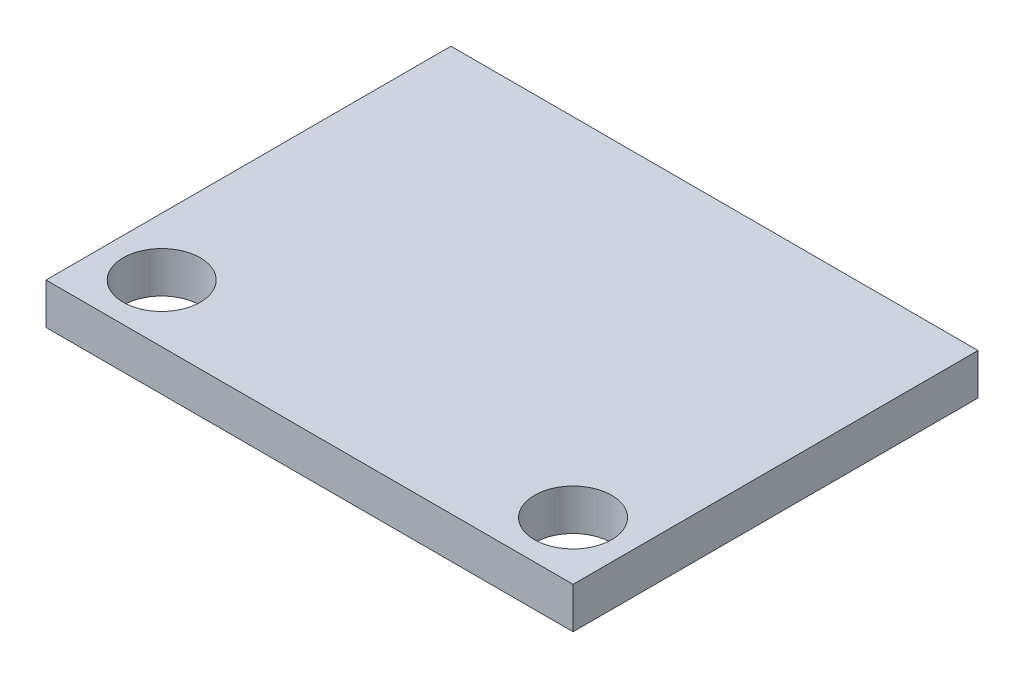
ISO-10303-21;
HEADER;
FILE_DESCRIPTION(('STEP AP214'),'2;1');
FILE_NAME('part.step','',(''),(''),'','','');
FILE_SCHEMA(('AUTOMOTIVE_DESIGN { 1 0 10303 214 1 1 1 1 }'));
ENDSEC;
DATA;
#1=APPLICATION_CONTEXT('core data for automotive mechanical design processes');
#2=APPLICATION_PROTOCOL_DEFINITION('international standard','automotive_design',2000,#1);
#3=PRODUCT_CONTEXT('',#1,'mechanical');
#4=PRODUCT('Part','Part','',(#3));
#5=PRODUCT_RELATED_PRODUCT_CATEGORY('part','',(#4));
#6=PRODUCT_DEFINITION_FORMATION('','',#4);
#7=PRODUCT_DEFINITION_CONTEXT('part definition',#1,'design');
#8=PRODUCT_DEFINITION('design','',#6,#7);
#9=PRODUCT_DEFINITION_SHAPE('','',#8);
#10=(LENGTH_UNIT() NAMED_UNIT(*) SI_UNIT(.MILLI.,.METRE.));
#11=(NAMED_UNIT(*) PLANE_ANGLE_UNIT() SI_UNIT($,.RADIAN.));
#12=(NAMED_UNIT(*) SI_UNIT($,.STERADIAN.) SOLID_ANGLE_UNIT());
#13=UNCERTAINTY_MEASURE_WITH_UNIT(LENGTH_MEASURE(1.E-05),#10,'distance_accuracy_value','');
#14=(GEOMETRIC_REPRESENTATION_CONTEXT(3) GLOBAL_UNCERTAINTY_ASSIGNED_CONTEXT((#13)) GLOBAL_UNIT_ASSIGNED_CONTEXT((#10,
#11,#12)) REPRESENTATION_CONTEXT('',''));
#15=CARTESIAN_POINT('',(0.,0.,0.));
#16=DIRECTION('',(0.,0.,1.));
#17=DIRECTION('',(1.,0.,0.));
#18=AXIS2_PLACEMENT_3D('',#15,#16,#17);
#19=CARTESIAN_POINT('',(0.,1.6,0.));
#20=DIRECTION('',(0.,-1.,0.));
#21=DIRECTION('',(0.,0.,-1.));
#22=AXIS2_PLACEMENT_3D('',#19,#20,#21);
#23=PLANE('',#22);
#24=DIRECTION('',(0.,0.,-1.));
#25=VECTOR('',#24,1.);
#26=CARTESIAN_POINT('',(10.25,1.6,7.875));
#27=LINE('',#26,#25);
#28=CARTESIAN_POINT('',(10.25,1.6,7.875));
#29=VERTEX_POINT('',#28);
#30=CARTESIAN_POINT('',(10.25,1.6,-7.875));
#31=VERTEX_POINT('',#30);
#32=EDGE_CURVE('E93',#29,#31,#27,.T.);
#33=ORIENTED_EDGE('',*,*,#32,.T.);
#34=DIRECTION('',(-1.,0.,0.));
#35=VECTOR('',#34,1.);
#36=CARTESIAN_POINT('',(-10.25,1.6,-7.875));
#37=LINE('',#36,#35);
#38=CARTESIAN_POINT('',(-10.25,1.6,-7.875));
#39=VERTEX_POINT('',#38);
#40=EDGE_CURVE('E88',#31,#39,#37,.T.);
#41=ORIENTED_EDGE('',*,*,#40,.T.);
#42=DIRECTION('',(0.,0.,1.));
#43=VECTOR('',#42,1.);
#44=CARTESIAN_POINT('',(-10.25,1.6,7.875));
#45=LINE('',#44,#43);
#46=CARTESIAN_POINT('',(-10.25,1.6,7.875));
#47=VERTEX_POINT('',#46);
#48=EDGE_CURVE('E91',#39,#47,#45,.T.);
#49=ORIENTED_EDGE('',*,*,#48,.T.);
#50=DIRECTION('',(1.,0.,0.));
#51=VECTOR('',#50,1.);
#52=CARTESIAN_POINT('',(-10.25,1.6,7.875));
#53=LINE('',#52,#51);
#54=EDGE_CURVE('E58',#47,#29,#53,.T.);
#55=ORIENTED_EDGE('',*,*,#54,.T.);
#56=EDGE_LOOP('',(#33,#41,#49,#55));
#57=FACE_BOUND('',#56,.T.);
#58=CARTESIAN_POINT('',(8.,1.6,5.625));
#59=DIRECTION('',(0.,1.,0.));
#60=DIRECTION('',(0.,0.,1.));
#61=AXIS2_PLACEMENT_3D('',#58,#59,#60);
#62=CIRCLE('',#61,1.5);
#63=CARTESIAN_POINT('',(8.,1.6,7.125));
#64=VERTEX_POINT('',#63);
#65=EDGE_CURVE('E108',#64,#64,#62,.T.);
#66=ORIENTED_EDGE('',*,*,#65,.F.);
#67=EDGE_LOOP('',(#66));
#68=FACE_BOUND('',#67,.T.);
#69=CARTESIAN_POINT('',(-8.00000000000001,1.6,5.625));
#70=DIRECTION('',(0.,1.,0.));
#71=DIRECTION('',(0.,0.,-1.));
#72=AXIS2_PLACEMENT_3D('',#69,#70,#71);
#73=CIRCLE('',#72,1.5);
#74=CARTESIAN_POINT('',(-8.00000000000001,1.6,4.125));
#75=VERTEX_POINT('',#74);
#76=EDGE_CURVE('E123',#75,#75,#73,.T.);
#77=ORIENTED_EDGE('',*,*,#76,.F.);
#78=EDGE_LOOP('',(#77));
#79=FACE_BOUND('',#78,.T.);
#80=ADVANCED_FACE('F41',(#57,#68,#79),#23,.F.);
#81=CARTESIAN_POINT('',(0.,0.,0.));
#82=DIRECTION('',(0.,-1.,0.));
#83=DIRECTION('',(0.,0.,-1.));
#84=AXIS2_PLACEMENT_3D('',#81,#82,#83);
#85=PLANE('',#84);
#86=CARTESIAN_POINT('',(8.,0.,5.625));
#87=DIRECTION('',(0.,1.,0.));
#88=DIRECTION('',(0.,0.,1.));
#89=AXIS2_PLACEMENT_3D('',#86,#87,#88);
#90=CIRCLE('',#89,1.5);
#91=CARTESIAN_POINT('',(8.,0.,7.125));
#92=VERTEX_POINT('',#91);
#93=EDGE_CURVE('E120',#92,#92,#90,.T.);
#94=ORIENTED_EDGE('',*,*,#93,.T.);
#95=EDGE_LOOP('',(#94));
#96=FACE_BOUND('',#95,.T.);
#97=DIRECTION('',(0.,0.,-1.));
#98=VECTOR('',#97,1.);
#99=CARTESIAN_POINT('',(10.25,0.,7.875));
#100=LINE('',#99,#98);
#101=CARTESIAN_POINT('',(10.25,0.,7.875));
#102=VERTEX_POINT('',#101);
#103=CARTESIAN_POINT('',(10.25,0.,-7.875));
#104=VERTEX_POINT('',#103);
#105=EDGE_CURVE('E105',#102,#104,#100,.T.);
#106=ORIENTED_EDGE('',*,*,#105,.F.);
#107=DIRECTION('',(1.,0.,0.));
#108=VECTOR('',#107,1.);
#109=CARTESIAN_POINT('',(-10.25,0.,7.875));
#110=LINE('',#109,#108);
#111=CARTESIAN_POINT('',(-10.25,0.,7.875));
#112=VERTEX_POINT('',#111);
#113=EDGE_CURVE('E81',#112,#102,#110,.T.);
#114=ORIENTED_EDGE('',*,*,#113,.F.);
#115=DIRECTION('',(0.,0.,1.));
#116=VECTOR('',#115,1.);
#117=CARTESIAN_POINT('',(-10.25,0.,7.875));
#118=LINE('',#117,#116);
#119=CARTESIAN_POINT('',(-10.25,0.,-7.875));
#120=VERTEX_POINT('',#119);
#121=EDGE_CURVE('E75',#120,#112,#118,.T.);
#122=ORIENTED_EDGE('',*,*,#121,.F.);
#123=DIRECTION('',(-1.,0.,0.));
#124=VECTOR('',#123,1.);
#125=CARTESIAN_POINT('',(-10.25,0.,-7.875));
#126=LINE('',#125,#124);
#127=EDGE_CURVE('E97',#104,#120,#126,.T.);
#128=ORIENTED_EDGE('',*,*,#127,.F.);
#129=EDGE_LOOP('',(#106,#114,#122,#128));
#130=FACE_BOUND('',#129,.T.);
#131=CARTESIAN_POINT('',(-8.00000000000001,0.,5.625));
#132=DIRECTION('',(0.,1.,0.));
#133=DIRECTION('',(0.,0.,-1.));
#134=AXIS2_PLACEMENT_3D('',#131,#132,#133);
#135=CIRCLE('',#134,1.5);
#136=CARTESIAN_POINT('',(-8.00000000000001,0.,4.125));
#137=VERTEX_POINT('',#136);
#138=EDGE_CURVE('E126',#137,#137,#135,.T.);
#139=ORIENTED_EDGE('',*,*,#138,.T.);
#140=EDGE_LOOP('',(#139));
#141=FACE_BOUND('',#140,.T.);
#142=ADVANCED_FACE('F116',(#96,#130,#141),#85,.T.);
#143=CARTESIAN_POINT('',(10.25,1.6,7.875));
#144=DIRECTION('',(-1.,0.,0.));
#145=DIRECTION('',(0.,0.,1.));
#146=AXIS2_PLACEMENT_3D('',#143,#144,#145);
#147=PLANE('',#146);
#148=ORIENTED_EDGE('',*,*,#105,.T.);
#149=DIRECTION('',(0.,-1.,0.));
#150=VECTOR('',#149,1.);
#151=CARTESIAN_POINT('',(10.25,1.6,-7.875));
#152=LINE('',#151,#150);
#153=EDGE_CURVE('E11',#31,#104,#152,.T.);
#154=ORIENTED_EDGE('',*,*,#153,.F.);
#155=ORIENTED_EDGE('',*,*,#32,.F.);
#156=DIRECTION('',(0.,-1.,0.));
#157=VECTOR('',#156,1.);
#158=CARTESIAN_POINT('',(10.25,1.6,7.875));
#159=LINE('',#158,#157);
#160=EDGE_CURVE('E101',#29,#102,#159,.T.);
#161=ORIENTED_EDGE('',*,*,#160,.T.);
#162=EDGE_LOOP('',(#148,#154,#155,#161));
#163=FACE_BOUND('',#162,.T.);
#164=ADVANCED_FACE('F43',(#163),#147,.F.);
#165=CARTESIAN_POINT('',(-10.25,1.6,-7.875));
#166=DIRECTION('',(0.,0.,1.));
#167=DIRECTION('',(1.,0.,0.));
#168=AXIS2_PLACEMENT_3D('',#165,#166,#167);
#169=PLANE('',#168);
#170=ORIENTED_EDGE('',*,*,#127,.T.);
#171=DIRECTION('',(0.,-1.,0.));
#172=VECTOR('',#171,1.);
#173=CARTESIAN_POINT('',(-10.25,1.6,-7.875));
#174=LINE('',#173,#172);
#175=EDGE_CURVE('E50',#39,#120,#174,.T.);
#176=ORIENTED_EDGE('',*,*,#175,.F.);
#177=ORIENTED_EDGE('',*,*,#40,.F.);
#178=ORIENTED_EDGE('',*,*,#153,.T.);
#179=EDGE_LOOP('',(#170,#176,#177,#178));
#180=FACE_BOUND('',#179,.T.);
#181=ADVANCED_FACE('F96',(#180),#169,.F.);
#182=CARTESIAN_POINT('',(-10.25,1.6,7.875));
#183=DIRECTION('',(1.,0.,0.));
#184=DIRECTION('',(0.,0.,-1.));
#185=AXIS2_PLACEMENT_3D('',#182,#183,#184);
#186=PLANE('',#185);
#187=ORIENTED_EDGE('',*,*,#121,.T.);
#188=DIRECTION('',(0.,-1.,0.));
#189=VECTOR('',#188,1.);
#190=CARTESIAN_POINT('',(-10.25,1.6,7.875));
#191=LINE('',#190,#189);
#192=EDGE_CURVE('E98',#47,#112,#191,.T.);
#193=ORIENTED_EDGE('',*,*,#192,.F.);
#194=ORIENTED_EDGE('',*,*,#48,.F.);
#195=ORIENTED_EDGE('',*,*,#175,.T.);
#196=EDGE_LOOP('',(#187,#193,#194,#195));
#197=FACE_BOUND('',#196,.T.);
#198=ADVANCED_FACE('F99',(#197),#186,.F.);
#199=CARTESIAN_POINT('',(-10.25,1.6,7.875));
#200=DIRECTION('',(0.,0.,-1.));
#201=DIRECTION('',(-1.,0.,0.));
#202=AXIS2_PLACEMENT_3D('',#199,#200,#201);
#203=PLANE('',#202);
#204=ORIENTED_EDGE('',*,*,#113,.T.);
#205=ORIENTED_EDGE('',*,*,#160,.F.);
#206=ORIENTED_EDGE('',*,*,#54,.F.);
#207=ORIENTED_EDGE('',*,*,#192,.T.);
#208=EDGE_LOOP('',(#204,#205,#206,#207));
#209=FACE_BOUND('',#208,.T.);
#210=ADVANCED_FACE('F113',(#209),#203,.F.);
#211=CARTESIAN_POINT('',(8.,1.6,5.625));
#212=DIRECTION('',(0.,-1.,0.));
#213=DIRECTION('',(0.,0.,-1.));
#214=AXIS2_PLACEMENT_3D('',#211,#212,#213);
#215=CYLINDRICAL_SURFACE('',#214,1.5);
#216=ORIENTED_EDGE('',*,*,#65,.T.);
#217=EDGE_LOOP('',(#216));
#218=FACE_BOUND('',#217,.T.);
#219=ORIENTED_EDGE('',*,*,#93,.F.);
#220=EDGE_LOOP('',(#219));
#221=FACE_BOUND('',#220,.T.);
#222=ADVANCED_FACE('F143',(#218,#221),#215,.F.);
#223=CARTESIAN_POINT('',(-8.00000000000001,1.6,5.625));
#224=DIRECTION('',(0.,-1.,0.));
#225=DIRECTION('',(0.,0.,-1.));
#226=AXIS2_PLACEMENT_3D('',#223,#224,#225);
#227=CYLINDRICAL_SURFACE('',#226,1.5);
#228=ORIENTED_EDGE('',*,*,#76,.T.);
#229=EDGE_LOOP('',(#228));
#230=FACE_BOUND('',#229,.T.);
#231=ORIENTED_EDGE('',*,*,#138,.F.);
#232=EDGE_LOOP('',(#231));
#233=FACE_BOUND('',#232,.T.);
#234=ADVANCED_FACE('F132',(#230,#233),#227,.F.);
#235=CLOSED_SHELL('',(#80,#142,#164,#181,#198,#210,#222,#234));
#236=MANIFOLD_SOLID_BREP('B2',#235);
#237=ADVANCED_BREP_SHAPE_REPRESENTATION('',(#18,#236),#14);
#238=SHAPE_DEFINITION_REPRESENTATION(#9,#237);
ENDSEC;
END-ISO-10303-21;
